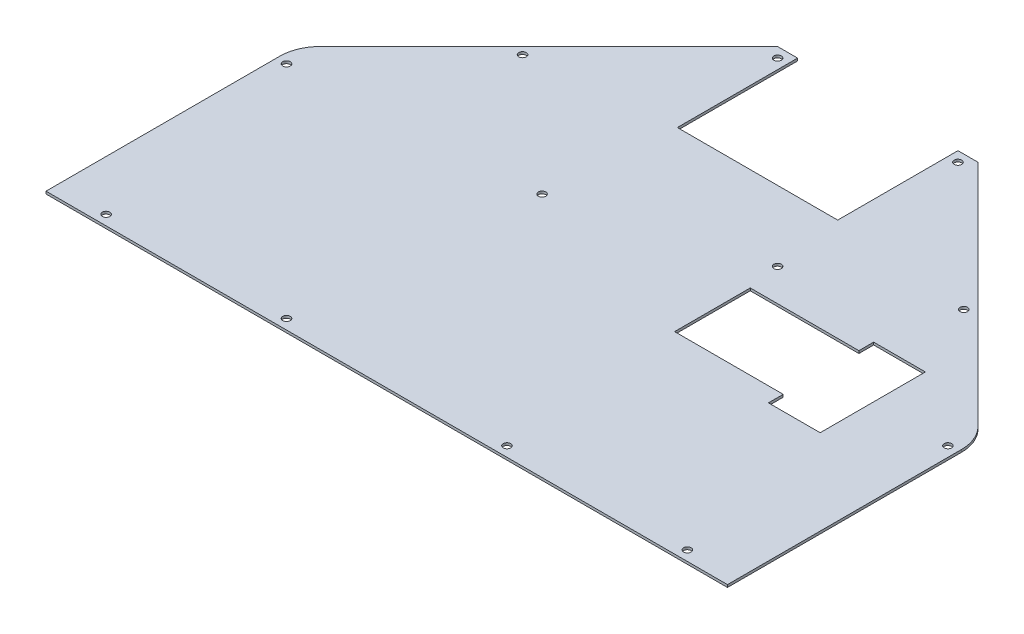
ISO-10303-21;
HEADER;
FILE_DESCRIPTION(('STEP AP214'),'2;1');
FILE_NAME('part.step','',(''),(''),'','','');
FILE_SCHEMA(('AUTOMOTIVE_DESIGN { 1 0 10303 214 1 1 1 1 }'));
ENDSEC;
DATA;
#1=APPLICATION_CONTEXT('core data for automotive mechanical design processes');
#2=APPLICATION_PROTOCOL_DEFINITION('international standard','automotive_design',2000,#1);
#3=PRODUCT_CONTEXT('',#1,'mechanical');
#4=PRODUCT('Part','Part','',(#3));
#5=PRODUCT_RELATED_PRODUCT_CATEGORY('part','',(#4));
#6=PRODUCT_DEFINITION_FORMATION('','',#4);
#7=PRODUCT_DEFINITION_CONTEXT('part definition',#1,'design');
#8=PRODUCT_DEFINITION('design','',#6,#7);
#9=PRODUCT_DEFINITION_SHAPE('','',#8);
#10=(LENGTH_UNIT() NAMED_UNIT(*) SI_UNIT(.MILLI.,.METRE.));
#11=(NAMED_UNIT(*) PLANE_ANGLE_UNIT() SI_UNIT($,.RADIAN.));
#12=(NAMED_UNIT(*) SI_UNIT($,.STERADIAN.) SOLID_ANGLE_UNIT());
#13=UNCERTAINTY_MEASURE_WITH_UNIT(LENGTH_MEASURE(1.E-05),#10,'distance_accuracy_value','');
#14=(GEOMETRIC_REPRESENTATION_CONTEXT(3) GLOBAL_UNCERTAINTY_ASSIGNED_CONTEXT((#13)) GLOBAL_UNIT_ASSIGNED_CONTEXT((#10,
#11,#12)) REPRESENTATION_CONTEXT('',''));
#15=CARTESIAN_POINT('',(0.,0.,0.));
#16=DIRECTION('',(0.,0.,1.));
#17=DIRECTION('',(1.,0.,0.));
#18=AXIS2_PLACEMENT_3D('',#15,#16,#17);
#19=CARTESIAN_POINT('',(215.9,1.5875,0.));
#20=DIRECTION('',(0.,0.,-1.));
#21=DIRECTION('',(-1.,0.,0.));
#22=AXIS2_PLACEMENT_3D('',#19,#20,#21);
#23=PLANE('',#22);
#24=DIRECTION('',(1.,0.,0.));
#25=VECTOR('',#24,1.);
#26=CARTESIAN_POINT('',(215.9,0.,0.));
#27=LINE('',#26,#25);
#28=CARTESIAN_POINT('',(0.,0.,0.));
#29=VERTEX_POINT('',#28);
#30=CARTESIAN_POINT('',(431.8,0.,0.));
#31=VERTEX_POINT('',#30);
#32=EDGE_CURVE('E266',#29,#31,#27,.T.);
#33=ORIENTED_EDGE('',*,*,#32,.T.);
#34=DIRECTION('',(0.,-1.,0.));
#35=VECTOR('',#34,1.);
#36=CARTESIAN_POINT('',(431.8,1.5875,0.));
#37=LINE('',#36,#35);
#38=CARTESIAN_POINT('',(431.8,1.5875,0.));
#39=VERTEX_POINT('',#38);
#40=EDGE_CURVE('E263',#39,#31,#37,.T.);
#41=ORIENTED_EDGE('',*,*,#40,.F.);
#42=DIRECTION('',(1.,0.,0.));
#43=VECTOR('',#42,1.);
#44=CARTESIAN_POINT('',(215.9,1.5875,0.));
#45=LINE('',#44,#43);
#46=CARTESIAN_POINT('',(0.,1.5875,0.));
#47=VERTEX_POINT('',#46);
#48=EDGE_CURVE('E267',#47,#39,#45,.T.);
#49=ORIENTED_EDGE('',*,*,#48,.F.);
#50=DIRECTION('',(0.,-1.,0.));
#51=VECTOR('',#50,1.);
#52=CARTESIAN_POINT('',(0.,1.5875,0.));
#53=LINE('',#52,#51);
#54=EDGE_CURVE('E282',#47,#29,#53,.T.);
#55=ORIENTED_EDGE('',*,*,#54,.T.);
#56=EDGE_LOOP('',(#33,#41,#49,#55));
#57=FACE_BOUND('',#56,.T.);
#58=ADVANCED_FACE('F35',(#57),#23,.F.);
#59=CARTESIAN_POINT('',(165.1,1.5875,-234.95));
#60=DIRECTION('',(0.,0.,1.));
#61=DIRECTION('',(1.,0.,0.));
#62=AXIS2_PLACEMENT_3D('',#59,#60,#61);
#63=PLANE('',#62);
#64=DIRECTION('',(-1.,0.,0.));
#65=VECTOR('',#64,1.);
#66=CARTESIAN_POINT('',(165.1,0.,-234.95));
#67=LINE('',#66,#65);
#68=CARTESIAN_POINT('',(266.7,0.,-234.95));
#69=VERTEX_POINT('',#68);
#70=CARTESIAN_POINT('',(165.1,0.,-234.95));
#71=VERTEX_POINT('',#70);
#72=EDGE_CURVE('E285',#69,#71,#67,.T.);
#73=ORIENTED_EDGE('',*,*,#72,.T.);
#74=DIRECTION('',(0.,-1.,0.));
#75=VECTOR('',#74,1.);
#76=CARTESIAN_POINT('',(165.1,1.5875,-234.95));
#77=LINE('',#76,#75);
#78=CARTESIAN_POINT('',(165.1,1.5875,-234.95));
#79=VERTEX_POINT('',#78);
#80=EDGE_CURVE('E303',#79,#71,#77,.T.);
#81=ORIENTED_EDGE('',*,*,#80,.F.);
#82=DIRECTION('',(-1.,0.,0.));
#83=VECTOR('',#82,1.);
#84=CARTESIAN_POINT('',(165.1,1.5875,-234.95));
#85=LINE('',#84,#83);
#86=CARTESIAN_POINT('',(266.7,1.5875,-234.95));
#87=VERTEX_POINT('',#86);
#88=EDGE_CURVE('E270',#87,#79,#85,.T.);
#89=ORIENTED_EDGE('',*,*,#88,.F.);
#90=DIRECTION('',(0.,-1.,0.));
#91=VECTOR('',#90,1.);
#92=CARTESIAN_POINT('',(266.7,1.5875,-234.95));
#93=LINE('',#92,#91);
#94=EDGE_CURVE('E247',#87,#69,#93,.T.);
#95=ORIENTED_EDGE('',*,*,#94,.T.);
#96=EDGE_LOOP('',(#73,#81,#89,#95));
#97=FACE_BOUND('',#96,.T.);
#98=ADVANCED_FACE('F335',(#97),#63,.F.);
#99=CARTESIAN_POINT('',(165.1,1.5875,-311.149999999999));
#100=DIRECTION('',(-1.,0.,0.));
#101=DIRECTION('',(0.,0.,1.));
#102=AXIS2_PLACEMENT_3D('',#99,#100,#101);
#103=PLANE('',#102);
#104=DIRECTION('',(0.,0.,-1.));
#105=VECTOR('',#104,1.);
#106=CARTESIAN_POINT('',(165.1,0.,-311.149999999999));
#107=LINE('',#106,#105);
#108=CARTESIAN_POINT('',(165.1,0.,-311.149999999999));
#109=VERTEX_POINT('',#108);
#110=EDGE_CURVE('E287',#71,#109,#107,.T.);
#111=ORIENTED_EDGE('',*,*,#110,.T.);
#112=DIRECTION('',(0.,-1.,0.));
#113=VECTOR('',#112,1.);
#114=CARTESIAN_POINT('',(165.1,1.5875,-311.149999999999));
#115=LINE('',#114,#113);
#116=CARTESIAN_POINT('',(165.1,1.5875,-311.149999999999));
#117=VERTEX_POINT('',#116);
#118=EDGE_CURVE('E300',#117,#109,#115,.T.);
#119=ORIENTED_EDGE('',*,*,#118,.F.);
#120=DIRECTION('',(0.,0.,-1.));
#121=VECTOR('',#120,1.);
#122=CARTESIAN_POINT('',(165.1,1.5875,-311.149999999999));
#123=LINE('',#122,#121);
#124=EDGE_CURVE('E273',#79,#117,#123,.T.);
#125=ORIENTED_EDGE('',*,*,#124,.F.);
#126=ORIENTED_EDGE('',*,*,#80,.T.);
#127=EDGE_LOOP('',(#111,#119,#125,#126));
#128=FACE_BOUND('',#127,.T.);
#129=ADVANCED_FACE('F342',(#128),#103,.F.);
#130=CARTESIAN_POINT('',(152.4,1.5875,-311.149999999999));
#131=DIRECTION('',(0.,0.,1.));
#132=DIRECTION('',(1.,0.,0.));
#133=AXIS2_PLACEMENT_3D('',#130,#131,#132);
#134=PLANE('',#133);
#135=DIRECTION('',(-1.,0.,0.));
#136=VECTOR('',#135,1.);
#137=CARTESIAN_POINT('',(152.4,0.,-311.149999999999));
#138=LINE('',#137,#136);
#139=CARTESIAN_POINT('',(152.4,0.,-311.149999999999));
#140=VERTEX_POINT('',#139);
#141=EDGE_CURVE('E289',#109,#140,#138,.T.);
#142=ORIENTED_EDGE('',*,*,#141,.T.);
#143=DIRECTION('',(0.,-1.,0.));
#144=VECTOR('',#143,1.);
#145=CARTESIAN_POINT('',(152.4,1.5875,-311.149999999999));
#146=LINE('',#145,#144);
#147=CARTESIAN_POINT('',(152.4,1.5875,-311.149999999999));
#148=VERTEX_POINT('',#147);
#149=EDGE_CURVE('E297',#148,#140,#146,.T.);
#150=ORIENTED_EDGE('',*,*,#149,.F.);
#151=DIRECTION('',(-1.,0.,0.));
#152=VECTOR('',#151,1.);
#153=CARTESIAN_POINT('',(152.4,1.5875,-311.149999999999));
#154=LINE('',#153,#152);
#155=EDGE_CURVE('E275',#117,#148,#154,.T.);
#156=ORIENTED_EDGE('',*,*,#155,.F.);
#157=ORIENTED_EDGE('',*,*,#118,.T.);
#158=EDGE_LOOP('',(#142,#150,#156,#157));
#159=FACE_BOUND('',#158,.T.);
#160=ADVANCED_FACE('F346',(#159),#134,.F.);
#161=CARTESIAN_POINT('',(0.,1.5875,-158.75));
#162=DIRECTION('',(0.707106781186545,0.,0.70710678118655));
#163=DIRECTION('',(0.70710678118655,0.,-0.707106781186545));
#164=AXIS2_PLACEMENT_3D('',#161,#162,#163);
#165=PLANE('',#164);
#166=DIRECTION('',(-0.70710678118655,0.,0.707106781186545));
#167=VECTOR('',#166,1.);
#168=CARTESIAN_POINT('',(0.,0.,-158.75));
#169=LINE('',#168,#167);
#170=CARTESIAN_POINT('',(7.43948775786176,0.,-166.189487757862));
#171=VERTEX_POINT('',#170);
#172=EDGE_CURVE('E291',#140,#171,#169,.T.);
#173=ORIENTED_EDGE('',*,*,#172,.T.);
#174=DIRECTION('',(0.,-1.,0.));
#175=VECTOR('',#174,1.);
#176=CARTESIAN_POINT('',(7.43948775786176,1.5875,-166.189487757862));
#177=LINE('',#176,#175);
#178=CARTESIAN_POINT('',(7.43948775786176,1.5875,-166.189487757862));
#179=VERTEX_POINT('',#178);
#180=EDGE_CURVE('E313',#171,#179,#177,.F.);
#181=ORIENTED_EDGE('',*,*,#180,.T.);
#182=DIRECTION('',(-0.70710678118655,0.,0.707106781186545));
#183=VECTOR('',#182,1.);
#184=CARTESIAN_POINT('',(0.,1.5875,-158.75));
#185=LINE('',#184,#183);
#186=EDGE_CURVE('E277',#148,#179,#185,.T.);
#187=ORIENTED_EDGE('',*,*,#186,.F.);
#188=ORIENTED_EDGE('',*,*,#149,.T.);
#189=EDGE_LOOP('',(#173,#181,#187,#188));
#190=FACE_BOUND('',#189,.T.);
#191=ADVANCED_FACE('F350',(#190),#165,.F.);
#192=CARTESIAN_POINT('',(0.,1.5875,0.));
#193=DIRECTION('',(1.,0.,0.));
#194=DIRECTION('',(0.,0.,-1.));
#195=AXIS2_PLACEMENT_3D('',#192,#193,#194);
#196=PLANE('',#195);
#197=DIRECTION('',(0.,0.,1.));
#198=VECTOR('',#197,1.);
#199=CARTESIAN_POINT('',(0.,1.5875,0.));
#200=LINE('',#199,#198);
#201=CARTESIAN_POINT('',(0.,1.5875,-148.228975515724));
#202=VERTEX_POINT('',#201);
#203=EDGE_CURVE('E280',#202,#47,#200,.T.);
#204=ORIENTED_EDGE('',*,*,#203,.F.);
#205=DIRECTION('',(0.,-1.,0.));
#206=VECTOR('',#205,1.);
#207=CARTESIAN_POINT('',(0.,1.5875,-148.228975515724));
#208=LINE('',#207,#206);
#209=CARTESIAN_POINT('',(0.,0.,-148.228975515724));
#210=VERTEX_POINT('',#209);
#211=EDGE_CURVE('E306',#202,#210,#208,.T.);
#212=ORIENTED_EDGE('',*,*,#211,.T.);
#213=DIRECTION('',(0.,0.,1.));
#214=VECTOR('',#213,1.);
#215=CARTESIAN_POINT('',(0.,0.,0.));
#216=LINE('',#215,#214);
#217=EDGE_CURVE('E271',#210,#29,#216,.T.);
#218=ORIENTED_EDGE('',*,*,#217,.T.);
#219=ORIENTED_EDGE('',*,*,#54,.F.);
#220=EDGE_LOOP('',(#204,#212,#218,#219));
#221=FACE_BOUND('',#220,.T.);
#222=ADVANCED_FACE('F358',(#221),#196,.F.);
#223=CARTESIAN_POINT('',(0.,1.5875,0.));
#224=DIRECTION('',(0.,-1.,0.));
#225=DIRECTION('',(0.,0.,-1.));
#226=AXIS2_PLACEMENT_3D('',#223,#224,#225);
#227=PLANE('',#226);
#228=CARTESIAN_POINT('',(76.0892253652751,1.5875,-225.858969244205));
#229=DIRECTION('',(0.,-1.,0.));
#230=DIRECTION('',(0.,0.,-1.));
#231=AXIS2_PLACEMENT_3D('',#228,#229,#230);
#232=CIRCLE('',#231,2.38125);
#233=CARTESIAN_POINT('',(76.0892253652751,1.5875,-228.240219244205));
#234=VERTEX_POINT('',#233);
#235=EDGE_CURVE('E478',#234,#234,#232,.T.);
#236=ORIENTED_EDGE('',*,*,#235,.T.);
#237=EDGE_LOOP('',(#236));
#238=FACE_BOUND('',#237,.T.);
#239=CARTESIAN_POINT('',(6.35,1.5875,-146.05));
#240=DIRECTION('',(0.,-1.,0.));
#241=DIRECTION('',(0.,0.,-1.));
#242=AXIS2_PLACEMENT_3D('',#239,#240,#241);
#243=CIRCLE('',#242,2.38125);
#244=CARTESIAN_POINT('',(6.35,1.5875,-148.43125));
#245=VERTEX_POINT('',#244);
#246=EDGE_CURVE('E486',#245,#245,#243,.T.);
#247=ORIENTED_EDGE('',*,*,#246,.T.);
#248=EDGE_LOOP('',(#247));
#249=FACE_BOUND('',#248,.T.);
#250=CARTESIAN_POINT('',(31.75,1.5875,-6.35));
#251=DIRECTION('',(0.,-1.,0.));
#252=DIRECTION('',(0.,0.,-1.));
#253=AXIS2_PLACEMENT_3D('',#250,#251,#252);
#254=CIRCLE('',#253,2.38125);
#255=CARTESIAN_POINT('',(31.75,1.5875,-8.73125));
#256=VERTEX_POINT('',#255);
#257=EDGE_CURVE('E492',#256,#256,#254,.T.);
#258=ORIENTED_EDGE('',*,*,#257,.T.);
#259=EDGE_LOOP('',(#258));
#260=FACE_BOUND('',#259,.T.);
#261=CARTESIAN_POINT('',(146.05,1.5875,-6.35));
#262=DIRECTION('',(0.,-1.,0.));
#263=DIRECTION('',(0.,0.,-1.));
#264=AXIS2_PLACEMENT_3D('',#261,#262,#263);
#265=CIRCLE('',#264,2.38125000000001);
#266=CARTESIAN_POINT('',(146.05,1.5875,-8.73125));
#267=VERTEX_POINT('',#266);
#268=EDGE_CURVE('E498',#267,#267,#265,.T.);
#269=ORIENTED_EDGE('',*,*,#268,.T.);
#270=EDGE_LOOP('',(#269));
#271=FACE_BOUND('',#270,.T.);
#272=CARTESIAN_POINT('',(158.75,1.5875,-155.574999999999));
#273=DIRECTION('',(0.,-1.,0.));
#274=DIRECTION('',(0.,0.,-1.));
#275=AXIS2_PLACEMENT_3D('',#272,#273,#274);
#276=CIRCLE('',#275,2.38125);
#277=CARTESIAN_POINT('',(158.75,1.5875,-157.956249999999));
#278=VERTEX_POINT('',#277);
#279=EDGE_CURVE('E504',#278,#278,#276,.T.);
#280=ORIENTED_EDGE('',*,*,#279,.T.);
#281=EDGE_LOOP('',(#280));
#282=FACE_BOUND('',#281,.T.);
#283=CARTESIAN_POINT('',(158.75,1.5875,-304.799999999999));
#284=DIRECTION('',(0.,-1.,0.));
#285=DIRECTION('',(0.,0.,-1.));
#286=AXIS2_PLACEMENT_3D('',#283,#284,#285);
#287=CIRCLE('',#286,2.38125000000001);
#288=CARTESIAN_POINT('',(158.75,1.5875,-307.181249999999));
#289=VERTEX_POINT('',#288);
#290=EDGE_CURVE('E510',#289,#289,#287,.T.);
#291=ORIENTED_EDGE('',*,*,#290,.T.);
#292=EDGE_LOOP('',(#291));
#293=FACE_BOUND('',#292,.T.);
#294=CARTESIAN_POINT('',(285.75,1.5875,-6.35));
#295=DIRECTION('',(0.,-1.,0.));
#296=DIRECTION('',(0.,0.,-1.));
#297=AXIS2_PLACEMENT_3D('',#294,#295,#296);
#298=CIRCLE('',#297,2.38125000000001);
#299=CARTESIAN_POINT('',(285.75,1.5875,-8.73125));
#300=VERTEX_POINT('',#299);
#301=EDGE_CURVE('E516',#300,#300,#298,.T.);
#302=ORIENTED_EDGE('',*,*,#301,.T.);
#303=EDGE_LOOP('',(#302));
#304=FACE_BOUND('',#303,.T.);
#305=CARTESIAN_POINT('',(273.05,1.5875,-190.499999999999));
#306=DIRECTION('',(0.,-1.,0.));
#307=DIRECTION('',(0.,0.,-1.));
#308=AXIS2_PLACEMENT_3D('',#305,#306,#307);
#309=CIRCLE('',#308,2.38125);
#310=CARTESIAN_POINT('',(273.05,1.5875,-192.881249999999));
#311=VERTEX_POINT('',#310);
#312=EDGE_CURVE('E522',#311,#311,#309,.T.);
#313=ORIENTED_EDGE('',*,*,#312,.T.);
#314=EDGE_LOOP('',(#313));
#315=FACE_BOUND('',#314,.T.);
#316=CARTESIAN_POINT('',(273.05,1.5875,-304.799999999999));
#317=DIRECTION('',(0.,-1.,0.));
#318=DIRECTION('',(0.,0.,-1.));
#319=AXIS2_PLACEMENT_3D('',#316,#317,#318);
#320=CIRCLE('',#319,2.38125000000001);
#321=CARTESIAN_POINT('',(273.05,1.5875,-307.181249999999));
#322=VERTEX_POINT('',#321);
#323=EDGE_CURVE('E528',#322,#322,#320,.T.);
#324=ORIENTED_EDGE('',*,*,#323,.T.);
#325=EDGE_LOOP('',(#324));
#326=FACE_BOUND('',#325,.T.);
#327=CARTESIAN_POINT('',(355.710774634725,1.5875,-225.858969244205));
#328=DIRECTION('',(0.,-1.,0.));
#329=DIRECTION('',(0.,0.,-1.));
#330=AXIS2_PLACEMENT_3D('',#327,#328,#329);
#331=CIRCLE('',#330,2.38125);
#332=CARTESIAN_POINT('',(355.710774634725,1.5875,-228.240219244205));
#333=VERTEX_POINT('',#332);
#334=EDGE_CURVE('E534',#333,#333,#331,.T.);
#335=ORIENTED_EDGE('',*,*,#334,.T.);
#336=EDGE_LOOP('',(#335));
#337=FACE_BOUND('',#336,.T.);
#338=CARTESIAN_POINT('',(425.45,1.5875,-146.05));
#339=DIRECTION('',(0.,-1.,0.));
#340=DIRECTION('',(0.,0.,-1.));
#341=AXIS2_PLACEMENT_3D('',#338,#339,#340);
#342=CIRCLE('',#341,2.38125);
#343=CARTESIAN_POINT('',(425.45,1.5875,-148.43125));
#344=VERTEX_POINT('',#343);
#345=EDGE_CURVE('E540',#344,#344,#342,.T.);
#346=ORIENTED_EDGE('',*,*,#345,.T.);
#347=EDGE_LOOP('',(#346));
#348=FACE_BOUND('',#347,.T.);
#349=CARTESIAN_POINT('',(400.05,1.5875,-6.34999999999999));
#350=DIRECTION('',(0.,-1.,0.));
#351=DIRECTION('',(0.,0.,-1.));
#352=AXIS2_PLACEMENT_3D('',#349,#350,#351);
#353=CIRCLE('',#352,2.38125000000001);
#354=CARTESIAN_POINT('',(400.05,1.5875,-8.73125));
#355=VERTEX_POINT('',#354);
#356=EDGE_CURVE('E546',#355,#355,#353,.T.);
#357=ORIENTED_EDGE('',*,*,#356,.T.);
#358=EDGE_LOOP('',(#357));
#359=FACE_BOUND('',#358,.T.);
#360=DIRECTION('',(1.,0.,0.));
#361=VECTOR('',#360,1.);
#362=CARTESIAN_POINT('',(345.059000000001,1.5875,-122.079275668015));
#363=LINE('',#362,#361);
#364=CARTESIAN_POINT('',(276.225000000001,1.5875,-122.079275668015));
#365=VERTEX_POINT('',#364);
#366=CARTESIAN_POINT('',(345.059000000001,1.5875,-122.079275668015));
#367=VERTEX_POINT('',#366);
#368=EDGE_CURVE('E200',#365,#367,#363,.T.);
#369=ORIENTED_EDGE('',*,*,#368,.F.);
#370=DIRECTION('',(0.,0.,1.));
#371=VECTOR('',#370,1.);
#372=CARTESIAN_POINT('',(276.225000000001,1.5875,-122.079275668015));
#373=LINE('',#372,#371);
#374=CARTESIAN_POINT('',(276.225000000001,1.5875,-170.020724331984));
#375=VERTEX_POINT('',#374);
#376=EDGE_CURVE('E191',#375,#365,#373,.T.);
#377=ORIENTED_EDGE('',*,*,#376,.F.);
#378=DIRECTION('',(-1.,0.,0.));
#379=VECTOR('',#378,1.);
#380=CARTESIAN_POINT('',(276.225000000001,1.5875,-170.020724331984));
#381=LINE('',#380,#379);
#382=CARTESIAN_POINT('',(345.059000000001,1.5875,-170.020724331984));
#383=VERTEX_POINT('',#382);
#384=EDGE_CURVE('E192',#383,#375,#381,.T.);
#385=ORIENTED_EDGE('',*,*,#384,.F.);
#386=DIRECTION('',(0.,0.,1.));
#387=VECTOR('',#386,1.);
#388=CARTESIAN_POINT('',(345.059000000001,1.5875,-170.020724331984));
#389=LINE('',#388,#387);
#390=CARTESIAN_POINT('',(345.059000000001,1.5875,-179.3875));
#391=VERTEX_POINT('',#390);
#392=EDGE_CURVE('E219',#391,#383,#389,.T.);
#393=ORIENTED_EDGE('',*,*,#392,.F.);
#394=DIRECTION('',(-1.,0.,0.));
#395=VECTOR('',#394,1.);
#396=CARTESIAN_POINT('',(345.059000000001,1.5875,-179.3875));
#397=LINE('',#396,#395);
#398=CARTESIAN_POINT('',(377.825,1.5875,-179.3875));
#399=VERTEX_POINT('',#398);
#400=EDGE_CURVE('E216',#399,#391,#397,.T.);
#401=ORIENTED_EDGE('',*,*,#400,.F.);
#402=DIRECTION('',(0.,0.,-1.));
#403=VECTOR('',#402,1.);
#404=CARTESIAN_POINT('',(377.825,1.5875,-179.3875));
#405=LINE('',#404,#403);
#406=CARTESIAN_POINT('',(377.825,1.5875,-112.7125));
#407=VERTEX_POINT('',#406);
#408=EDGE_CURVE('E213',#407,#399,#405,.T.);
#409=ORIENTED_EDGE('',*,*,#408,.F.);
#410=DIRECTION('',(1.,0.,0.));
#411=VECTOR('',#410,1.);
#412=CARTESIAN_POINT('',(377.825,1.5875,-112.7125));
#413=LINE('',#412,#411);
#414=CARTESIAN_POINT('',(345.059000000001,1.5875,-112.7125));
#415=VERTEX_POINT('',#414);
#416=EDGE_CURVE('E210',#415,#407,#413,.T.);
#417=ORIENTED_EDGE('',*,*,#416,.F.);
#418=DIRECTION('',(0.,0.,1.));
#419=VECTOR('',#418,1.);
#420=CARTESIAN_POINT('',(345.059000000001,1.5875,-112.7125));
#421=LINE('',#420,#419);
#422=EDGE_CURVE('E207',#367,#415,#421,.T.);
#423=ORIENTED_EDGE('',*,*,#422,.F.);
#424=EDGE_LOOP('',(#369,#377,#385,#393,#401,#409,#417,#423));
#425=FACE_BOUND('',#424,.T.);
#426=ORIENTED_EDGE('',*,*,#186,.T.);
#427=CARTESIAN_POINT('',(25.4,1.5875,-148.228975515724));
#428=DIRECTION('',(0.,-1.,0.));
#429=DIRECTION('',(0.,0.,-1.));
#430=AXIS2_PLACEMENT_3D('',#427,#428,#429);
#431=CIRCLE('',#430,25.4);
#432=EDGE_CURVE('E316',#179,#202,#431,.F.);
#433=ORIENTED_EDGE('',*,*,#432,.T.);
#434=ORIENTED_EDGE('',*,*,#203,.T.);
#435=ORIENTED_EDGE('',*,*,#48,.T.);
#436=DIRECTION('',(0.,0.,1.));
#437=VECTOR('',#436,1.);
#438=CARTESIAN_POINT('',(431.8,1.5875,0.));
#439=LINE('',#438,#437);
#440=CARTESIAN_POINT('',(431.8,1.5875,-148.228975515724));
#441=VERTEX_POINT('',#440);
#442=EDGE_CURVE('E236',#441,#39,#439,.T.);
#443=ORIENTED_EDGE('',*,*,#442,.F.);
#444=CARTESIAN_POINT('',(406.4,1.5875,-148.228975515724));
#445=DIRECTION('',(0.,-1.,0.));
#446=DIRECTION('',(0.,0.,-1.));
#447=AXIS2_PLACEMENT_3D('',#444,#445,#446);
#448=CIRCLE('',#447,25.4);
#449=CARTESIAN_POINT('',(424.360512242138,1.5875,-166.189487757862));
#450=VERTEX_POINT('',#449);
#451=EDGE_CURVE('E50',#441,#450,#448,.F.);
#452=ORIENTED_EDGE('',*,*,#451,.T.);
#453=DIRECTION('',(0.70710678118655,0.,0.707106781186545));
#454=VECTOR('',#453,1.);
#455=CARTESIAN_POINT('',(431.8,1.5875,-158.750000000001));
#456=LINE('',#455,#454);
#457=CARTESIAN_POINT('',(279.4,1.5875,-311.149999999999));
#458=VERTEX_POINT('',#457);
#459=EDGE_CURVE('E238',#458,#450,#456,.T.);
#460=ORIENTED_EDGE('',*,*,#459,.F.);
#461=DIRECTION('',(1.,0.,0.));
#462=VECTOR('',#461,1.);
#463=CARTESIAN_POINT('',(279.4,1.5875,-311.149999999999));
#464=LINE('',#463,#462);
#465=CARTESIAN_POINT('',(266.7,1.5875,-311.149999999999));
#466=VERTEX_POINT('',#465);
#467=EDGE_CURVE('E241',#466,#458,#464,.T.);
#468=ORIENTED_EDGE('',*,*,#467,.F.);
#469=DIRECTION('',(0.,0.,-1.));
#470=VECTOR('',#469,1.);
#471=CARTESIAN_POINT('',(266.7,1.5875,-311.149999999999));
#472=LINE('',#471,#470);
#473=EDGE_CURVE('E244',#87,#466,#472,.T.);
#474=ORIENTED_EDGE('',*,*,#473,.F.);
#475=ORIENTED_EDGE('',*,*,#88,.T.);
#476=ORIENTED_EDGE('',*,*,#124,.T.);
#477=ORIENTED_EDGE('',*,*,#155,.T.);
#478=EDGE_LOOP('',(#426,#433,#434,#435,#443,#452,#460,#468,#474,#475,#476,#477));
#479=FACE_BOUND('',#478,.T.);
#480=ADVANCED_FACE('F329',(#238,#249,#260,#271,#282,#293,#304,#315,#326,#337,#348,#359,#425,
#479),#227,.F.);
#481=CARTESIAN_POINT('',(0.,0.,0.));
#482=DIRECTION('',(0.,-1.,0.));
#483=DIRECTION('',(0.,0.,-1.));
#484=AXIS2_PLACEMENT_3D('',#481,#482,#483);
#485=PLANE('',#484);
#486=CARTESIAN_POINT('',(76.0892253652751,0.,-225.858969244205));
#487=DIRECTION('',(0.,-1.,0.));
#488=DIRECTION('',(0.,0.,-1.));
#489=AXIS2_PLACEMENT_3D('',#486,#487,#488);
#490=CIRCLE('',#489,2.38125);
#491=CARTESIAN_POINT('',(76.0892253652751,0.,-228.240219244205));
#492=VERTEX_POINT('',#491);
#493=EDGE_CURVE('E481',#492,#492,#490,.T.);
#494=ORIENTED_EDGE('',*,*,#493,.F.);
#495=EDGE_LOOP('',(#494));
#496=FACE_BOUND('',#495,.T.);
#497=CARTESIAN_POINT('',(6.35,0.,-146.05));
#498=DIRECTION('',(0.,-1.,0.));
#499=DIRECTION('',(0.,0.,-1.));
#500=AXIS2_PLACEMENT_3D('',#497,#498,#499);
#501=CIRCLE('',#500,2.38125);
#502=CARTESIAN_POINT('',(6.35,0.,-148.43125));
#503=VERTEX_POINT('',#502);
#504=EDGE_CURVE('E483',#503,#503,#501,.T.);
#505=ORIENTED_EDGE('',*,*,#504,.F.);
#506=EDGE_LOOP('',(#505));
#507=FACE_BOUND('',#506,.T.);
#508=CARTESIAN_POINT('',(31.75,0.,-6.35));
#509=DIRECTION('',(0.,-1.,0.));
#510=DIRECTION('',(0.,0.,-1.));
#511=AXIS2_PLACEMENT_3D('',#508,#509,#510);
#512=CIRCLE('',#511,2.38125);
#513=CARTESIAN_POINT('',(31.75,0.,-8.73125));
#514=VERTEX_POINT('',#513);
#515=EDGE_CURVE('E489',#514,#514,#512,.T.);
#516=ORIENTED_EDGE('',*,*,#515,.F.);
#517=EDGE_LOOP('',(#516));
#518=FACE_BOUND('',#517,.T.);
#519=CARTESIAN_POINT('',(146.05,0.,-6.35));
#520=DIRECTION('',(0.,-1.,0.));
#521=DIRECTION('',(0.,0.,-1.));
#522=AXIS2_PLACEMENT_3D('',#519,#520,#521);
#523=CIRCLE('',#522,2.38125000000001);
#524=CARTESIAN_POINT('',(146.05,0.,-8.73125));
#525=VERTEX_POINT('',#524);
#526=EDGE_CURVE('E495',#525,#525,#523,.T.);
#527=ORIENTED_EDGE('',*,*,#526,.F.);
#528=EDGE_LOOP('',(#527));
#529=FACE_BOUND('',#528,.T.);
#530=CARTESIAN_POINT('',(158.75,0.,-155.574999999999));
#531=DIRECTION('',(0.,-1.,0.));
#532=DIRECTION('',(0.,0.,-1.));
#533=AXIS2_PLACEMENT_3D('',#530,#531,#532);
#534=CIRCLE('',#533,2.38125);
#535=CARTESIAN_POINT('',(158.75,0.,-157.956249999999));
#536=VERTEX_POINT('',#535);
#537=EDGE_CURVE('E501',#536,#536,#534,.T.);
#538=ORIENTED_EDGE('',*,*,#537,.F.);
#539=EDGE_LOOP('',(#538));
#540=FACE_BOUND('',#539,.T.);
#541=CARTESIAN_POINT('',(158.75,0.,-304.799999999999));
#542=DIRECTION('',(0.,-1.,0.));
#543=DIRECTION('',(0.,0.,-1.));
#544=AXIS2_PLACEMENT_3D('',#541,#542,#543);
#545=CIRCLE('',#544,2.38125000000001);
#546=CARTESIAN_POINT('',(158.75,0.,-307.181249999999));
#547=VERTEX_POINT('',#546);
#548=EDGE_CURVE('E507',#547,#547,#545,.T.);
#549=ORIENTED_EDGE('',*,*,#548,.F.);
#550=EDGE_LOOP('',(#549));
#551=FACE_BOUND('',#550,.T.);
#552=CARTESIAN_POINT('',(285.75,0.,-6.35));
#553=DIRECTION('',(0.,-1.,0.));
#554=DIRECTION('',(0.,0.,-1.));
#555=AXIS2_PLACEMENT_3D('',#552,#553,#554);
#556=CIRCLE('',#555,2.38125000000001);
#557=CARTESIAN_POINT('',(285.75,0.,-8.73125));
#558=VERTEX_POINT('',#557);
#559=EDGE_CURVE('E513',#558,#558,#556,.T.);
#560=ORIENTED_EDGE('',*,*,#559,.F.);
#561=EDGE_LOOP('',(#560));
#562=FACE_BOUND('',#561,.T.);
#563=CARTESIAN_POINT('',(273.05,0.,-190.499999999999));
#564=DIRECTION('',(0.,-1.,0.));
#565=DIRECTION('',(0.,0.,-1.));
#566=AXIS2_PLACEMENT_3D('',#563,#564,#565);
#567=CIRCLE('',#566,2.38125);
#568=CARTESIAN_POINT('',(273.05,0.,-192.881249999999));
#569=VERTEX_POINT('',#568);
#570=EDGE_CURVE('E519',#569,#569,#567,.T.);
#571=ORIENTED_EDGE('',*,*,#570,.F.);
#572=EDGE_LOOP('',(#571));
#573=FACE_BOUND('',#572,.T.);
#574=CARTESIAN_POINT('',(273.05,0.,-304.799999999999));
#575=DIRECTION('',(0.,-1.,0.));
#576=DIRECTION('',(0.,0.,-1.));
#577=AXIS2_PLACEMENT_3D('',#574,#575,#576);
#578=CIRCLE('',#577,2.38125000000001);
#579=CARTESIAN_POINT('',(273.05,0.,-307.181249999999));
#580=VERTEX_POINT('',#579);
#581=EDGE_CURVE('E525',#580,#580,#578,.T.);
#582=ORIENTED_EDGE('',*,*,#581,.F.);
#583=EDGE_LOOP('',(#582));
#584=FACE_BOUND('',#583,.T.);
#585=CARTESIAN_POINT('',(355.710774634725,0.,-225.858969244205));
#586=DIRECTION('',(0.,-1.,0.));
#587=DIRECTION('',(0.,0.,-1.));
#588=AXIS2_PLACEMENT_3D('',#585,#586,#587);
#589=CIRCLE('',#588,2.38125);
#590=CARTESIAN_POINT('',(355.710774634725,0.,-228.240219244205));
#591=VERTEX_POINT('',#590);
#592=EDGE_CURVE('E531',#591,#591,#589,.T.);
#593=ORIENTED_EDGE('',*,*,#592,.F.);
#594=EDGE_LOOP('',(#593));
#595=FACE_BOUND('',#594,.T.);
#596=CARTESIAN_POINT('',(425.45,0.,-146.05));
#597=DIRECTION('',(0.,-1.,0.));
#598=DIRECTION('',(0.,0.,-1.));
#599=AXIS2_PLACEMENT_3D('',#596,#597,#598);
#600=CIRCLE('',#599,2.38125);
#601=CARTESIAN_POINT('',(425.45,0.,-148.43125));
#602=VERTEX_POINT('',#601);
#603=EDGE_CURVE('E537',#602,#602,#600,.T.);
#604=ORIENTED_EDGE('',*,*,#603,.F.);
#605=EDGE_LOOP('',(#604));
#606=FACE_BOUND('',#605,.T.);
#607=CARTESIAN_POINT('',(400.05,0.,-6.34999999999999));
#608=DIRECTION('',(0.,-1.,0.));
#609=DIRECTION('',(0.,0.,-1.));
#610=AXIS2_PLACEMENT_3D('',#607,#608,#609);
#611=CIRCLE('',#610,2.38125000000001);
#612=CARTESIAN_POINT('',(400.05,0.,-8.73125));
#613=VERTEX_POINT('',#612);
#614=EDGE_CURVE('E543',#613,#613,#611,.T.);
#615=ORIENTED_EDGE('',*,*,#614,.F.);
#616=EDGE_LOOP('',(#615));
#617=FACE_BOUND('',#616,.T.);
#618=DIRECTION('',(0.,0.,1.));
#619=VECTOR('',#618,1.);
#620=CARTESIAN_POINT('',(276.225000000001,0.,-122.079275668015));
#621=LINE('',#620,#619);
#622=CARTESIAN_POINT('',(276.225000000001,0.,-170.020724331984));
#623=VERTEX_POINT('',#622);
#624=CARTESIAN_POINT('',(276.225000000001,0.,-122.079275668015));
#625=VERTEX_POINT('',#624);
#626=EDGE_CURVE('E188',#623,#625,#621,.T.);
#627=ORIENTED_EDGE('',*,*,#626,.T.);
#628=DIRECTION('',(1.,0.,0.));
#629=VECTOR('',#628,1.);
#630=CARTESIAN_POINT('',(345.059000000001,0.,-122.079275668015));
#631=LINE('',#630,#629);
#632=CARTESIAN_POINT('',(345.059000000001,0.,-122.079275668015));
#633=VERTEX_POINT('',#632);
#634=EDGE_CURVE('E172',#625,#633,#631,.T.);
#635=ORIENTED_EDGE('',*,*,#634,.T.);
#636=DIRECTION('',(0.,0.,1.));
#637=VECTOR('',#636,1.);
#638=CARTESIAN_POINT('',(345.059000000001,0.,-112.7125));
#639=LINE('',#638,#637);
#640=CARTESIAN_POINT('',(345.059000000001,0.,-112.7125));
#641=VERTEX_POINT('',#640);
#642=EDGE_CURVE('E549',#633,#641,#639,.T.);
#643=ORIENTED_EDGE('',*,*,#642,.T.);
#644=DIRECTION('',(1.,0.,0.));
#645=VECTOR('',#644,1.);
#646=CARTESIAN_POINT('',(377.825,0.,-112.7125));
#647=LINE('',#646,#645);
#648=CARTESIAN_POINT('',(377.825,0.,-112.7125));
#649=VERTEX_POINT('',#648);
#650=EDGE_CURVE('E553',#641,#649,#647,.T.);
#651=ORIENTED_EDGE('',*,*,#650,.T.);
#652=DIRECTION('',(0.,0.,-1.));
#653=VECTOR('',#652,1.);
#654=CARTESIAN_POINT('',(377.825,0.,-179.3875));
#655=LINE('',#654,#653);
#656=CARTESIAN_POINT('',(377.825,0.,-179.3875));
#657=VERTEX_POINT('',#656);
#658=EDGE_CURVE('E556',#649,#657,#655,.T.);
#659=ORIENTED_EDGE('',*,*,#658,.T.);
#660=DIRECTION('',(-1.,0.,0.));
#661=VECTOR('',#660,1.);
#662=CARTESIAN_POINT('',(345.059000000001,0.,-179.3875));
#663=LINE('',#662,#661);
#664=CARTESIAN_POINT('',(345.059000000001,0.,-179.3875));
#665=VERTEX_POINT('',#664);
#666=EDGE_CURVE('E559',#657,#665,#663,.T.);
#667=ORIENTED_EDGE('',*,*,#666,.T.);
#668=DIRECTION('',(0.,0.,1.));
#669=VECTOR('',#668,1.);
#670=CARTESIAN_POINT('',(345.059000000001,0.,-170.020724331984));
#671=LINE('',#670,#669);
#672=CARTESIAN_POINT('',(345.059000000001,0.,-170.020724331984));
#673=VERTEX_POINT('',#672);
#674=EDGE_CURVE('E202',#665,#673,#671,.T.);
#675=ORIENTED_EDGE('',*,*,#674,.T.);
#676=DIRECTION('',(-1.,0.,0.));
#677=VECTOR('',#676,1.);
#678=CARTESIAN_POINT('',(276.225000000001,0.,-170.020724331984));
#679=LINE('',#678,#677);
#680=EDGE_CURVE('E198',#673,#623,#679,.T.);
#681=ORIENTED_EDGE('',*,*,#680,.T.);
#682=EDGE_LOOP('',(#627,#635,#643,#651,#659,#667,#675,#681));
#683=FACE_BOUND('',#682,.T.);
#684=ORIENTED_EDGE('',*,*,#217,.F.);
#685=CARTESIAN_POINT('',(25.4,0.,-148.228975515724));
#686=DIRECTION('',(0.,-1.,0.));
#687=DIRECTION('',(0.,0.,-1.));
#688=AXIS2_PLACEMENT_3D('',#685,#686,#687);
#689=CIRCLE('',#688,25.4);
#690=EDGE_CURVE('E311',#210,#171,#689,.T.);
#691=ORIENTED_EDGE('',*,*,#690,.T.);
#692=ORIENTED_EDGE('',*,*,#172,.F.);
#693=ORIENTED_EDGE('',*,*,#141,.F.);
#694=ORIENTED_EDGE('',*,*,#110,.F.);
#695=ORIENTED_EDGE('',*,*,#72,.F.);
#696=DIRECTION('',(0.,0.,-1.));
#697=VECTOR('',#696,1.);
#698=CARTESIAN_POINT('',(266.7,0.,-311.149999999999));
#699=LINE('',#698,#697);
#700=CARTESIAN_POINT('',(266.7,0.,-311.149999999999));
#701=VERTEX_POINT('',#700);
#702=EDGE_CURVE('E239',#69,#701,#699,.T.);
#703=ORIENTED_EDGE('',*,*,#702,.T.);
#704=DIRECTION('',(1.,0.,0.));
#705=VECTOR('',#704,1.);
#706=CARTESIAN_POINT('',(279.4,0.,-311.149999999999));
#707=LINE('',#706,#705);
#708=CARTESIAN_POINT('',(279.4,0.,-311.149999999999));
#709=VERTEX_POINT('',#708);
#710=EDGE_CURVE('E252',#701,#709,#707,.T.);
#711=ORIENTED_EDGE('',*,*,#710,.T.);
#712=DIRECTION('',(0.70710678118655,0.,0.707106781186545));
#713=VECTOR('',#712,1.);
#714=CARTESIAN_POINT('',(431.8,0.,-158.750000000001));
#715=LINE('',#714,#713);
#716=CARTESIAN_POINT('',(424.360512242138,0.,-166.189487757862));
#717=VERTEX_POINT('',#716);
#718=EDGE_CURVE('E249',#709,#717,#715,.T.);
#719=ORIENTED_EDGE('',*,*,#718,.T.);
#720=CARTESIAN_POINT('',(406.4,0.,-148.228975515724));
#721=DIRECTION('',(0.,-1.,0.));
#722=DIRECTION('',(0.,0.,-1.));
#723=AXIS2_PLACEMENT_3D('',#720,#721,#722);
#724=CIRCLE('',#723,25.4);
#725=CARTESIAN_POINT('',(431.8,0.,-148.228975515724));
#726=VERTEX_POINT('',#725);
#727=EDGE_CURVE('E309',#717,#726,#724,.T.);
#728=ORIENTED_EDGE('',*,*,#727,.T.);
#729=DIRECTION('',(0.,0.,1.));
#730=VECTOR('',#729,1.);
#731=CARTESIAN_POINT('',(431.8,0.,0.));
#732=LINE('',#731,#730);
#733=EDGE_CURVE('E183',#726,#31,#732,.T.);
#734=ORIENTED_EDGE('',*,*,#733,.T.);
#735=ORIENTED_EDGE('',*,*,#32,.F.);
#736=EDGE_LOOP('',(#684,#691,#692,#693,#694,#695,#703,#711,#719,#728,#734,#735));
#737=FACE_BOUND('',#736,.T.);
#738=ADVANCED_FACE('F195',(#496,#507,#518,#529,#540,#551,#562,#573,#584,#595,#606,#617,#683,
#737),#485,.T.);
#739=CARTESIAN_POINT('',(431.8,1.5875,0.));
#740=DIRECTION('',(1.,0.,0.));
#741=DIRECTION('',(0.,0.,-1.));
#742=AXIS2_PLACEMENT_3D('',#739,#740,#741);
#743=PLANE('',#742);
#744=ORIENTED_EDGE('',*,*,#733,.F.);
#745=DIRECTION('',(0.,-1.,0.));
#746=VECTOR('',#745,1.);
#747=CARTESIAN_POINT('',(431.8,1.5875,-148.228975515724));
#748=LINE('',#747,#746);
#749=EDGE_CURVE('E11',#726,#441,#748,.F.);
#750=ORIENTED_EDGE('',*,*,#749,.T.);
#751=ORIENTED_EDGE('',*,*,#442,.T.);
#752=ORIENTED_EDGE('',*,*,#40,.T.);
#753=EDGE_LOOP('',(#744,#750,#751,#752));
#754=FACE_BOUND('',#753,.T.);
#755=ADVANCED_FACE('F364',(#754),#743,.T.);
#756=CARTESIAN_POINT('',(431.8,1.5875,-158.750000000001));
#757=DIRECTION('',(0.707106781186545,0.,-0.70710678118655));
#758=DIRECTION('',(-0.70710678118655,0.,-0.707106781186545));
#759=AXIS2_PLACEMENT_3D('',#756,#757,#758);
#760=PLANE('',#759);
#761=ORIENTED_EDGE('',*,*,#459,.T.);
#762=DIRECTION('',(0.,-1.,0.));
#763=VECTOR('',#762,1.);
#764=CARTESIAN_POINT('',(424.360512242138,1.5875,-166.189487757862));
#765=LINE('',#764,#763);
#766=EDGE_CURVE('E43',#450,#717,#765,.T.);
#767=ORIENTED_EDGE('',*,*,#766,.T.);
#768=ORIENTED_EDGE('',*,*,#718,.F.);
#769=DIRECTION('',(0.,-1.,0.));
#770=VECTOR('',#769,1.);
#771=CARTESIAN_POINT('',(279.4,1.5875,-311.149999999999));
#772=LINE('',#771,#770);
#773=EDGE_CURVE('E261',#458,#709,#772,.T.);
#774=ORIENTED_EDGE('',*,*,#773,.F.);
#775=EDGE_LOOP('',(#761,#767,#768,#774));
#776=FACE_BOUND('',#775,.T.);
#777=ADVANCED_FACE('F321',(#776),#760,.T.);
#778=CARTESIAN_POINT('',(279.4,1.5875,-311.149999999999));
#779=DIRECTION('',(0.,0.,-1.));
#780=DIRECTION('',(-1.,0.,0.));
#781=AXIS2_PLACEMENT_3D('',#778,#779,#780);
#782=PLANE('',#781);
#783=ORIENTED_EDGE('',*,*,#710,.F.);
#784=DIRECTION('',(0.,-1.,0.));
#785=VECTOR('',#784,1.);
#786=CARTESIAN_POINT('',(266.7,1.5875,-311.149999999999));
#787=LINE('',#786,#785);
#788=EDGE_CURVE('E259',#466,#701,#787,.T.);
#789=ORIENTED_EDGE('',*,*,#788,.F.);
#790=ORIENTED_EDGE('',*,*,#467,.T.);
#791=ORIENTED_EDGE('',*,*,#773,.T.);
#792=EDGE_LOOP('',(#783,#789,#790,#791));
#793=FACE_BOUND('',#792,.T.);
#794=ADVANCED_FACE('F327',(#793),#782,.T.);
#795=CARTESIAN_POINT('',(266.7,1.5875,-311.149999999999));
#796=DIRECTION('',(-1.,0.,0.));
#797=DIRECTION('',(0.,0.,1.));
#798=AXIS2_PLACEMENT_3D('',#795,#796,#797);
#799=PLANE('',#798);
#800=ORIENTED_EDGE('',*,*,#702,.F.);
#801=ORIENTED_EDGE('',*,*,#94,.F.);
#802=ORIENTED_EDGE('',*,*,#473,.T.);
#803=ORIENTED_EDGE('',*,*,#788,.T.);
#804=EDGE_LOOP('',(#800,#801,#802,#803));
#805=FACE_BOUND('',#804,.T.);
#806=ADVANCED_FACE('F333',(#805),#799,.T.);
#807=CARTESIAN_POINT('',(276.225000000001,-0.000999999999999916,-122.079275668015));
#808=DIRECTION('',(-1.,0.,0.));
#809=DIRECTION('',(0.,0.,1.));
#810=AXIS2_PLACEMENT_3D('',#807,#808,#809);
#811=PLANE('',#810);
#812=DIRECTION('',(0.,1.,0.));
#813=VECTOR('',#812,1.);
#814=CARTESIAN_POINT('',(276.225000000001,-0.000999999999999916,-170.020724331984));
#815=LINE('',#814,#813);
#816=EDGE_CURVE('E184',#623,#375,#815,.T.);
#817=ORIENTED_EDGE('',*,*,#816,.T.);
#818=ORIENTED_EDGE('',*,*,#376,.T.);
#819=DIRECTION('',(0.,1.,0.));
#820=VECTOR('',#819,1.);
#821=CARTESIAN_POINT('',(276.225000000001,-0.000999999999999916,-122.079275668015));
#822=LINE('',#821,#820);
#823=EDGE_CURVE('E176',#625,#365,#822,.T.);
#824=ORIENTED_EDGE('',*,*,#823,.F.);
#825=ORIENTED_EDGE('',*,*,#626,.F.);
#826=EDGE_LOOP('',(#817,#818,#824,#825));
#827=FACE_BOUND('',#826,.T.);
#828=ADVANCED_FACE('F187',(#827),#811,.F.);
#829=CARTESIAN_POINT('',(276.225000000001,-0.000999999999999916,-170.020724331984));
#830=DIRECTION('',(0.,0.,-1.));
#831=DIRECTION('',(-1.,0.,0.));
#832=AXIS2_PLACEMENT_3D('',#829,#830,#831);
#833=PLANE('',#832);
#834=DIRECTION('',(0.,1.,0.));
#835=VECTOR('',#834,1.);
#836=CARTESIAN_POINT('',(345.059000000001,-0.000999999999999916,-170.020724331984));
#837=LINE('',#836,#835);
#838=EDGE_CURVE('E225',#673,#383,#837,.T.);
#839=ORIENTED_EDGE('',*,*,#838,.T.);
#840=ORIENTED_EDGE('',*,*,#384,.T.);
#841=ORIENTED_EDGE('',*,*,#816,.F.);
#842=ORIENTED_EDGE('',*,*,#680,.F.);
#843=EDGE_LOOP('',(#839,#840,#841,#842));
#844=FACE_BOUND('',#843,.T.);
#845=ADVANCED_FACE('F401',(#844),#833,.F.);
#846=CARTESIAN_POINT('',(345.059000000001,-0.000999999999999916,-170.020724331984));
#847=DIRECTION('',(-1.,0.,0.));
#848=DIRECTION('',(0.,0.,1.));
#849=AXIS2_PLACEMENT_3D('',#846,#847,#848);
#850=PLANE('',#849);
#851=DIRECTION('',(0.,1.,0.));
#852=VECTOR('',#851,1.);
#853=CARTESIAN_POINT('',(345.059000000001,-0.000999999999999916,-179.3875));
#854=LINE('',#853,#852);
#855=EDGE_CURVE('E227',#665,#391,#854,.T.);
#856=ORIENTED_EDGE('',*,*,#855,.T.);
#857=ORIENTED_EDGE('',*,*,#392,.T.);
#858=ORIENTED_EDGE('',*,*,#838,.F.);
#859=ORIENTED_EDGE('',*,*,#674,.F.);
#860=EDGE_LOOP('',(#856,#857,#858,#859));
#861=FACE_BOUND('',#860,.T.);
#862=ADVANCED_FACE('F420',(#861),#850,.F.);
#863=CARTESIAN_POINT('',(345.059000000001,-0.000999999999999916,-179.3875));
#864=DIRECTION('',(0.,0.,-1.));
#865=DIRECTION('',(-1.,0.,0.));
#866=AXIS2_PLACEMENT_3D('',#863,#864,#865);
#867=PLANE('',#866);
#868=DIRECTION('',(0.,1.,0.));
#869=VECTOR('',#868,1.);
#870=CARTESIAN_POINT('',(377.825,-0.000999999999999916,-179.3875));
#871=LINE('',#870,#869);
#872=EDGE_CURVE('E229',#657,#399,#871,.T.);
#873=ORIENTED_EDGE('',*,*,#872,.T.);
#874=ORIENTED_EDGE('',*,*,#400,.T.);
#875=ORIENTED_EDGE('',*,*,#855,.F.);
#876=ORIENTED_EDGE('',*,*,#666,.F.);
#877=EDGE_LOOP('',(#873,#874,#875,#876));
#878=FACE_BOUND('',#877,.T.);
#879=ADVANCED_FACE('F416',(#878),#867,.F.);
#880=CARTESIAN_POINT('',(377.825,-0.000999999999999916,-179.3875));
#881=DIRECTION('',(1.,0.,0.));
#882=DIRECTION('',(0.,0.,-1.));
#883=AXIS2_PLACEMENT_3D('',#880,#881,#882);
#884=PLANE('',#883);
#885=DIRECTION('',(0.,1.,0.));
#886=VECTOR('',#885,1.);
#887=CARTESIAN_POINT('',(377.825,-0.000999999999999916,-112.7125));
#888=LINE('',#887,#886);
#889=EDGE_CURVE('E231',#649,#407,#888,.T.);
#890=ORIENTED_EDGE('',*,*,#889,.T.);
#891=ORIENTED_EDGE('',*,*,#408,.T.);
#892=ORIENTED_EDGE('',*,*,#872,.F.);
#893=ORIENTED_EDGE('',*,*,#658,.F.);
#894=EDGE_LOOP('',(#890,#891,#892,#893));
#895=FACE_BOUND('',#894,.T.);
#896=ADVANCED_FACE('F412',(#895),#884,.F.);
#897=CARTESIAN_POINT('',(377.825,-0.000999999999999916,-112.7125));
#898=DIRECTION('',(0.,0.,1.));
#899=DIRECTION('',(1.,0.,0.));
#900=AXIS2_PLACEMENT_3D('',#897,#898,#899);
#901=PLANE('',#900);
#902=DIRECTION('',(0.,1.,0.));
#903=VECTOR('',#902,1.);
#904=CARTESIAN_POINT('',(345.059000000001,-0.000999999999999916,-112.7125));
#905=LINE('',#904,#903);
#906=EDGE_CURVE('E233',#641,#415,#905,.T.);
#907=ORIENTED_EDGE('',*,*,#906,.T.);
#908=ORIENTED_EDGE('',*,*,#416,.T.);
#909=ORIENTED_EDGE('',*,*,#889,.F.);
#910=ORIENTED_EDGE('',*,*,#650,.F.);
#911=EDGE_LOOP('',(#907,#908,#909,#910));
#912=FACE_BOUND('',#911,.T.);
#913=ADVANCED_FACE('F408',(#912),#901,.F.);
#914=CARTESIAN_POINT('',(345.059000000001,-0.000999999999999916,-112.7125));
#915=DIRECTION('',(-1.,0.,0.));
#916=DIRECTION('',(0.,0.,1.));
#917=AXIS2_PLACEMENT_3D('',#914,#915,#916);
#918=PLANE('',#917);
#919=DIRECTION('',(0.,1.,0.));
#920=VECTOR('',#919,1.);
#921=CARTESIAN_POINT('',(345.059000000001,-0.000999999999999916,-122.079275668015));
#922=LINE('',#921,#920);
#923=EDGE_CURVE('E178',#633,#367,#922,.T.);
#924=ORIENTED_EDGE('',*,*,#923,.T.);
#925=ORIENTED_EDGE('',*,*,#422,.T.);
#926=ORIENTED_EDGE('',*,*,#906,.F.);
#927=ORIENTED_EDGE('',*,*,#642,.F.);
#928=EDGE_LOOP('',(#924,#925,#926,#927));
#929=FACE_BOUND('',#928,.T.);
#930=ADVANCED_FACE('F405',(#929),#918,.F.);
#931=CARTESIAN_POINT('',(345.059000000001,-0.000999999999999916,-122.079275668015));
#932=DIRECTION('',(0.,0.,1.));
#933=DIRECTION('',(1.,0.,0.));
#934=AXIS2_PLACEMENT_3D('',#931,#932,#933);
#935=PLANE('',#934);
#936=ORIENTED_EDGE('',*,*,#823,.T.);
#937=ORIENTED_EDGE('',*,*,#368,.T.);
#938=ORIENTED_EDGE('',*,*,#923,.F.);
#939=ORIENTED_EDGE('',*,*,#634,.F.);
#940=EDGE_LOOP('',(#936,#937,#938,#939));
#941=FACE_BOUND('',#940,.T.);
#942=ADVANCED_FACE('F174',(#941),#935,.F.);
#943=CARTESIAN_POINT('',(400.05,1.5875,-6.34999999999999));
#944=DIRECTION('',(0.,-1.,0.));
#945=DIRECTION('',(0.,0.,-1.));
#946=AXIS2_PLACEMENT_3D('',#943,#944,#945);
#947=CYLINDRICAL_SURFACE('',#946,2.38125000000001);
#948=ORIENTED_EDGE('',*,*,#356,.F.);
#949=EDGE_LOOP('',(#948));
#950=FACE_BOUND('',#949,.T.);
#951=ORIENTED_EDGE('',*,*,#614,.T.);
#952=EDGE_LOOP('',(#951));
#953=FACE_BOUND('',#952,.T.);
#954=ADVANCED_FACE('F404',(#950,#953),#947,.F.);
#955=CARTESIAN_POINT('',(425.45,1.5875,-146.05));
#956=DIRECTION('',(0.,-1.,0.));
#957=DIRECTION('',(0.,0.,-1.));
#958=AXIS2_PLACEMENT_3D('',#955,#956,#957);
#959=CYLINDRICAL_SURFACE('',#958,2.38125);
#960=ORIENTED_EDGE('',*,*,#345,.F.);
#961=EDGE_LOOP('',(#960));
#962=FACE_BOUND('',#961,.T.);
#963=ORIENTED_EDGE('',*,*,#603,.T.);
#964=EDGE_LOOP('',(#963));
#965=FACE_BOUND('',#964,.T.);
#966=ADVANCED_FACE('F430',(#962,#965),#959,.F.);
#967=CARTESIAN_POINT('',(355.710774634725,1.5875,-225.858969244205));
#968=DIRECTION('',(0.,-1.,0.));
#969=DIRECTION('',(0.,0.,-1.));
#970=AXIS2_PLACEMENT_3D('',#967,#968,#969);
#971=CYLINDRICAL_SURFACE('',#970,2.38125);
#972=ORIENTED_EDGE('',*,*,#334,.F.);
#973=EDGE_LOOP('',(#972));
#974=FACE_BOUND('',#973,.T.);
#975=ORIENTED_EDGE('',*,*,#592,.T.);
#976=EDGE_LOOP('',(#975));
#977=FACE_BOUND('',#976,.T.);
#978=ADVANCED_FACE('F434',(#974,#977),#971,.F.);
#979=CARTESIAN_POINT('',(273.05,1.5875,-304.799999999999));
#980=DIRECTION('',(0.,-1.,0.));
#981=DIRECTION('',(0.,0.,-1.));
#982=AXIS2_PLACEMENT_3D('',#979,#980,#981);
#983=CYLINDRICAL_SURFACE('',#982,2.38125000000001);
#984=ORIENTED_EDGE('',*,*,#323,.F.);
#985=EDGE_LOOP('',(#984));
#986=FACE_BOUND('',#985,.T.);
#987=ORIENTED_EDGE('',*,*,#581,.T.);
#988=EDGE_LOOP('',(#987));
#989=FACE_BOUND('',#988,.T.);
#990=ADVANCED_FACE('F438',(#986,#989),#983,.F.);
#991=CARTESIAN_POINT('',(273.05,1.5875,-190.499999999999));
#992=DIRECTION('',(0.,-1.,0.));
#993=DIRECTION('',(0.,0.,-1.));
#994=AXIS2_PLACEMENT_3D('',#991,#992,#993);
#995=CYLINDRICAL_SURFACE('',#994,2.38125);
#996=ORIENTED_EDGE('',*,*,#312,.F.);
#997=EDGE_LOOP('',(#996));
#998=FACE_BOUND('',#997,.T.);
#999=ORIENTED_EDGE('',*,*,#570,.T.);
#1000=EDGE_LOOP('',(#999));
#1001=FACE_BOUND('',#1000,.T.);
#1002=ADVANCED_FACE('F442',(#998,#1001),#995,.F.);
#1003=CARTESIAN_POINT('',(285.75,1.5875,-6.35));
#1004=DIRECTION('',(0.,-1.,0.));
#1005=DIRECTION('',(0.,0.,-1.));
#1006=AXIS2_PLACEMENT_3D('',#1003,#1004,#1005);
#1007=CYLINDRICAL_SURFACE('',#1006,2.38125000000001);
#1008=ORIENTED_EDGE('',*,*,#301,.F.);
#1009=EDGE_LOOP('',(#1008));
#1010=FACE_BOUND('',#1009,.T.);
#1011=ORIENTED_EDGE('',*,*,#559,.T.);
#1012=EDGE_LOOP('',(#1011));
#1013=FACE_BOUND('',#1012,.T.);
#1014=ADVANCED_FACE('F446',(#1010,#1013),#1007,.F.);
#1015=CARTESIAN_POINT('',(158.75,1.5875,-304.799999999999));
#1016=DIRECTION('',(0.,-1.,0.));
#1017=DIRECTION('',(0.,0.,-1.));
#1018=AXIS2_PLACEMENT_3D('',#1015,#1016,#1017);
#1019=CYLINDRICAL_SURFACE('',#1018,2.38125000000001);
#1020=ORIENTED_EDGE('',*,*,#290,.F.);
#1021=EDGE_LOOP('',(#1020));
#1022=FACE_BOUND('',#1021,.T.);
#1023=ORIENTED_EDGE('',*,*,#548,.T.);
#1024=EDGE_LOOP('',(#1023));
#1025=FACE_BOUND('',#1024,.T.);
#1026=ADVANCED_FACE('F450',(#1022,#1025),#1019,.F.);
#1027=CARTESIAN_POINT('',(158.75,1.5875,-155.574999999999));
#1028=DIRECTION('',(0.,-1.,0.));
#1029=DIRECTION('',(0.,0.,-1.));
#1030=AXIS2_PLACEMENT_3D('',#1027,#1028,#1029);
#1031=CYLINDRICAL_SURFACE('',#1030,2.38125);
#1032=ORIENTED_EDGE('',*,*,#279,.F.);
#1033=EDGE_LOOP('',(#1032));
#1034=FACE_BOUND('',#1033,.T.);
#1035=ORIENTED_EDGE('',*,*,#537,.T.);
#1036=EDGE_LOOP('',(#1035));
#1037=FACE_BOUND('',#1036,.T.);
#1038=ADVANCED_FACE('F454',(#1034,#1037),#1031,.F.);
#1039=CARTESIAN_POINT('',(146.05,1.5875,-6.35));
#1040=DIRECTION('',(0.,-1.,0.));
#1041=DIRECTION('',(0.,0.,-1.));
#1042=AXIS2_PLACEMENT_3D('',#1039,#1040,#1041);
#1043=CYLINDRICAL_SURFACE('',#1042,2.38125000000001);
#1044=ORIENTED_EDGE('',*,*,#268,.F.);
#1045=EDGE_LOOP('',(#1044));
#1046=FACE_BOUND('',#1045,.T.);
#1047=ORIENTED_EDGE('',*,*,#526,.T.);
#1048=EDGE_LOOP('',(#1047));
#1049=FACE_BOUND('',#1048,.T.);
#1050=ADVANCED_FACE('F458',(#1046,#1049),#1043,.F.);
#1051=CARTESIAN_POINT('',(31.75,1.5875,-6.35));
#1052=DIRECTION('',(0.,-1.,0.));
#1053=DIRECTION('',(0.,0.,-1.));
#1054=AXIS2_PLACEMENT_3D('',#1051,#1052,#1053);
#1055=CYLINDRICAL_SURFACE('',#1054,2.38125);
#1056=ORIENTED_EDGE('',*,*,#257,.F.);
#1057=EDGE_LOOP('',(#1056));
#1058=FACE_BOUND('',#1057,.T.);
#1059=ORIENTED_EDGE('',*,*,#515,.T.);
#1060=EDGE_LOOP('',(#1059));
#1061=FACE_BOUND('',#1060,.T.);
#1062=ADVANCED_FACE('F462',(#1058,#1061),#1055,.F.);
#1063=CARTESIAN_POINT('',(6.35,1.5875,-146.05));
#1064=DIRECTION('',(0.,-1.,0.));
#1065=DIRECTION('',(0.,0.,-1.));
#1066=AXIS2_PLACEMENT_3D('',#1063,#1064,#1065);
#1067=CYLINDRICAL_SURFACE('',#1066,2.38125);
#1068=ORIENTED_EDGE('',*,*,#246,.F.);
#1069=EDGE_LOOP('',(#1068));
#1070=FACE_BOUND('',#1069,.T.);
#1071=ORIENTED_EDGE('',*,*,#504,.T.);
#1072=EDGE_LOOP('',(#1071));
#1073=FACE_BOUND('',#1072,.T.);
#1074=ADVANCED_FACE('F466',(#1070,#1073),#1067,.F.);
#1075=CARTESIAN_POINT('',(76.0892253652751,1.5875,-225.858969244205));
#1076=DIRECTION('',(0.,-1.,0.));
#1077=DIRECTION('',(0.,0.,-1.));
#1078=AXIS2_PLACEMENT_3D('',#1075,#1076,#1077);
#1079=CYLINDRICAL_SURFACE('',#1078,2.38125);
#1080=ORIENTED_EDGE('',*,*,#235,.F.);
#1081=EDGE_LOOP('',(#1080));
#1082=FACE_BOUND('',#1081,.T.);
#1083=ORIENTED_EDGE('',*,*,#493,.T.);
#1084=EDGE_LOOP('',(#1083));
#1085=FACE_BOUND('',#1084,.T.);
#1086=ADVANCED_FACE('F369',(#1082,#1085),#1079,.F.);
#1087=CARTESIAN_POINT('',(25.4,1.5875,-148.228975515724));
#1088=DIRECTION('',(0.,-1.,0.));
#1089=DIRECTION('',(0.,0.,-1.));
#1090=AXIS2_PLACEMENT_3D('',#1087,#1088,#1089);
#1091=CYLINDRICAL_SURFACE('',#1090,25.4);
#1092=ORIENTED_EDGE('',*,*,#432,.F.);
#1093=ORIENTED_EDGE('',*,*,#180,.F.);
#1094=ORIENTED_EDGE('',*,*,#690,.F.);
#1095=ORIENTED_EDGE('',*,*,#211,.F.);
#1096=EDGE_LOOP('',(#1092,#1093,#1094,#1095));
#1097=FACE_BOUND('',#1096,.T.);
#1098=ADVANCED_FACE('F356',(#1097),#1091,.T.);
#1099=CARTESIAN_POINT('',(406.4,1.5875,-148.228975515724));
#1100=DIRECTION('',(0.,-1.,0.));
#1101=DIRECTION('',(0.,0.,-1.));
#1102=AXIS2_PLACEMENT_3D('',#1099,#1100,#1101);
#1103=CYLINDRICAL_SURFACE('',#1102,25.4);
#1104=ORIENTED_EDGE('',*,*,#451,.F.);
#1105=ORIENTED_EDGE('',*,*,#749,.F.);
#1106=ORIENTED_EDGE('',*,*,#727,.F.);
#1107=ORIENTED_EDGE('',*,*,#766,.F.);
#1108=EDGE_LOOP('',(#1104,#1105,#1106,#1107));
#1109=FACE_BOUND('',#1108,.T.);
#1110=ADVANCED_FACE('F37',(#1109),#1103,.T.);
#1111=CLOSED_SHELL('',(#58,#98,#129,#160,#191,#222,#480,#738,#755,#777,#794,#806,#828,#845,#862,
#879,#896,#913,#930,#942,#954,#966,#978,#990,#1002,#1014,#1026,#1038,#1050,#1062,#1074,#1086,
#1098,#1110));
#1112=MANIFOLD_SOLID_BREP('B2',#1111);
#1113=ADVANCED_BREP_SHAPE_REPRESENTATION('',(#18,#1112),#14);
#1114=SHAPE_DEFINITION_REPRESENTATION(#9,#1113);
ENDSEC;
END-ISO-10303-21;
